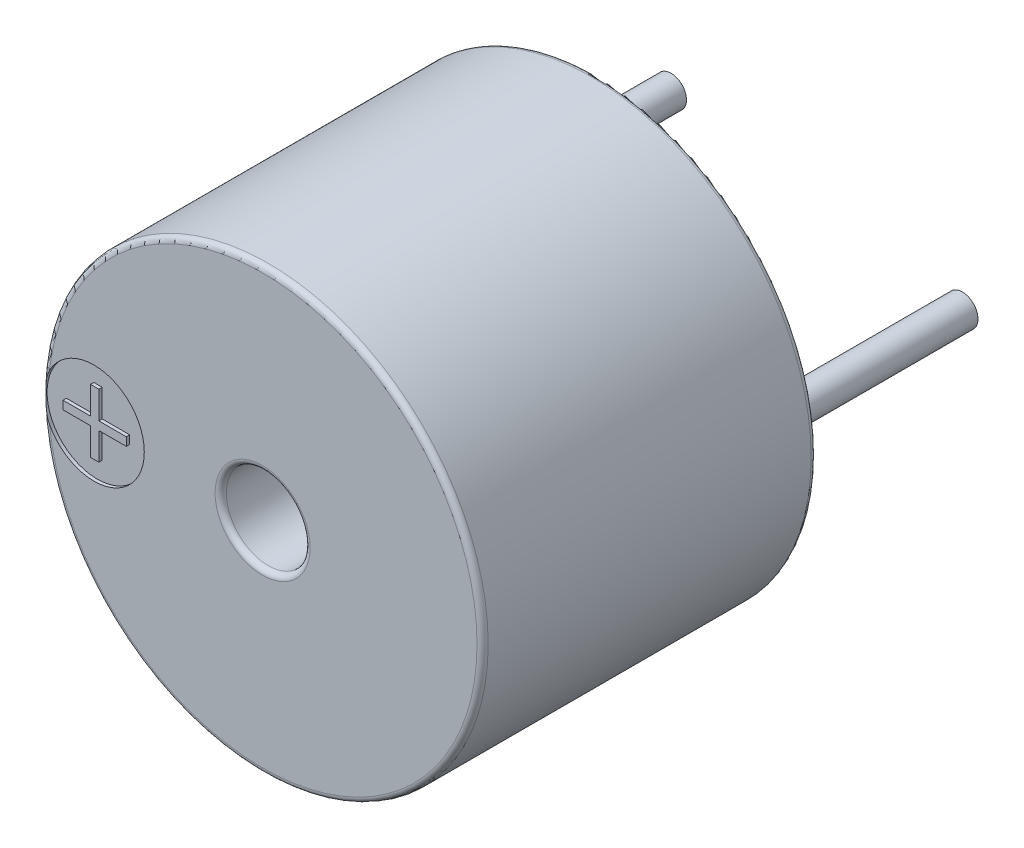
ISO-10303-21;
HEADER;
FILE_DESCRIPTION(('STEP AP214'),'2;1');
FILE_NAME('part.step','',(''),(''),'','','');
FILE_SCHEMA(('AUTOMOTIVE_DESIGN { 1 0 10303 214 1 1 1 1 }'));
ENDSEC;
DATA;
#1=APPLICATION_CONTEXT('core data for automotive mechanical design processes');
#2=APPLICATION_PROTOCOL_DEFINITION('international standard','automotive_design',2000,#1);
#3=PRODUCT_CONTEXT('',#1,'mechanical');
#4=PRODUCT('Part','Part','',(#3));
#5=PRODUCT_RELATED_PRODUCT_CATEGORY('part','',(#4));
#6=PRODUCT_DEFINITION_FORMATION('','',#4);
#7=PRODUCT_DEFINITION_CONTEXT('part definition',#1,'design');
#8=PRODUCT_DEFINITION('design','',#6,#7);
#9=PRODUCT_DEFINITION_SHAPE('','',#8);
#10=(LENGTH_UNIT() NAMED_UNIT(*) SI_UNIT(.MILLI.,.METRE.));
#11=(NAMED_UNIT(*) PLANE_ANGLE_UNIT() SI_UNIT($,.RADIAN.));
#12=(NAMED_UNIT(*) SI_UNIT($,.STERADIAN.) SOLID_ANGLE_UNIT());
#13=UNCERTAINTY_MEASURE_WITH_UNIT(LENGTH_MEASURE(1.E-05),#10,'distance_accuracy_value','');
#14=(GEOMETRIC_REPRESENTATION_CONTEXT(3) GLOBAL_UNCERTAINTY_ASSIGNED_CONTEXT((#13)) GLOBAL_UNIT_ASSIGNED_CONTEXT((#10,
#11,#12)) REPRESENTATION_CONTEXT('',''));
#15=CARTESIAN_POINT('',(0.,0.,0.));
#16=DIRECTION('',(0.,0.,1.));
#17=DIRECTION('',(1.,0.,0.));
#18=AXIS2_PLACEMENT_3D('',#15,#16,#17);
#19=CARTESIAN_POINT('',(0.,0.,7.5946));
#20=DIRECTION('',(0.,0.,1.));
#21=DIRECTION('',(1.,0.,0.));
#22=AXIS2_PLACEMENT_3D('',#19,#20,#21);
#23=PLANE('',#22);
#24=CARTESIAN_POINT('',(-3.83251607709667,0.,7.5946));
#25=DIRECTION('',(0.,0.,1.));
#26=DIRECTION('',(1.,0.,0.));
#27=AXIS2_PLACEMENT_3D('',#24,#25,#26);
#28=CIRCLE('',#27,1.143);
#29=CARTESIAN_POINT('',(-4.84379696449058,-0.532691249028728,7.5946));
#30=VERTEX_POINT('',#29);
#31=CARTESIAN_POINT('',(-4.84379696449059,0.532691249028715,7.5946));
#32=VERTEX_POINT('',#31);
#33=EDGE_CURVE('E63',#30,#32,#28,.T.);
#34=ORIENTED_EDGE('',*,*,#33,.F.);
#35=CARTESIAN_POINT('',(0.,0.,7.5946));
#36=DIRECTION('',(0.,0.,1.));
#37=DIRECTION('',(1.,0.,0.));
#38=AXIS2_PLACEMENT_3D('',#35,#36,#37);
#39=CIRCLE('',#38,4.873);
#40=EDGE_CURVE('E248',#30,#32,#39,.T.);
#41=ORIENTED_EDGE('',*,*,#40,.T.);
#42=EDGE_LOOP('',(#34,#41));
#43=FACE_BOUND('',#42,.T.);
#44=CARTESIAN_POINT('',(0.,0.,7.5946));
#45=DIRECTION('',(0.,0.,1.));
#46=DIRECTION('',(1.,0.,0.));
#47=AXIS2_PLACEMENT_3D('',#44,#45,#46);
#48=CIRCLE('',#47,1.0795);
#49=CARTESIAN_POINT('',(1.0795,0.,7.5946));
#50=VERTEX_POINT('',#49);
#51=EDGE_CURVE('E251',#50,#50,#48,.F.);
#52=ORIENTED_EDGE('',*,*,#51,.T.);
#53=EDGE_LOOP('',(#52));
#54=FACE_BOUND('',#53,.T.);
#55=ADVANCED_FACE('F37',(#43,#54),#23,.T.);
#56=CARTESIAN_POINT('',(0.,0.,0.));
#57=DIRECTION('',(0.,0.,1.));
#58=DIRECTION('',(1.,0.,0.));
#59=AXIS2_PLACEMENT_3D('',#56,#57,#58);
#60=PLANE('',#59);
#61=CARTESIAN_POINT('',(0.,0.,0.));
#62=DIRECTION('',(0.,0.,1.));
#63=DIRECTION('',(1.,0.,0.));
#64=AXIS2_PLACEMENT_3D('',#61,#62,#63);
#65=CIRCLE('',#64,4.873);
#66=CARTESIAN_POINT('',(4.873,0.,0.));
#67=VERTEX_POINT('',#66);
#68=EDGE_CURVE('E260',#67,#67,#65,.F.);
#69=ORIENTED_EDGE('',*,*,#68,.T.);
#70=EDGE_LOOP('',(#69));
#71=FACE_BOUND('',#70,.T.);
#72=CARTESIAN_POINT('',(-3.81,0.,0.));
#73=DIRECTION('',(0.,0.,1.));
#74=DIRECTION('',(1.,0.,0.));
#75=AXIS2_PLACEMENT_3D('',#72,#73,#74);
#76=CIRCLE('',#75,0.35);
#77=CARTESIAN_POINT('',(-3.46,0.,0.));
#78=VERTEX_POINT('',#77);
#79=EDGE_CURVE('E263',#78,#78,#76,.F.);
#80=ORIENTED_EDGE('',*,*,#79,.F.);
#81=EDGE_LOOP('',(#80));
#82=FACE_BOUND('',#81,.T.);
#83=CARTESIAN_POINT('',(3.81,0.,0.));
#84=DIRECTION('',(0.,0.,1.));
#85=DIRECTION('',(1.,0.,0.));
#86=AXIS2_PLACEMENT_3D('',#83,#84,#85);
#87=CIRCLE('',#86,0.3556);
#88=CARTESIAN_POINT('',(4.1656,0.,0.));
#89=VERTEX_POINT('',#88);
#90=EDGE_CURVE('E50',#89,#89,#87,.F.);
#91=ORIENTED_EDGE('',*,*,#90,.F.);
#92=EDGE_LOOP('',(#91));
#93=FACE_BOUND('',#92,.T.);
#94=ADVANCED_FACE('F270',(#71,#82,#93),#60,.F.);
#95=CARTESIAN_POINT('',(0.,0.,7.5946));
#96=DIRECTION('',(0.,0.,-1.));
#97=DIRECTION('',(-1.,0.,0.));
#98=AXIS2_PLACEMENT_3D('',#95,#96,#97);
#99=CYLINDRICAL_SURFACE('',#98,5.);
#100=CARTESIAN_POINT('',(0.,0.,0.127));
#101=DIRECTION('',(0.,0.,1.));
#102=DIRECTION('',(1.,0.,0.));
#103=AXIS2_PLACEMENT_3D('',#100,#101,#102);
#104=CIRCLE('',#103,5.);
#105=CARTESIAN_POINT('',(5.,0.,0.127));
#106=VERTEX_POINT('',#105);
#107=EDGE_CURVE('E257',#106,#106,#104,.T.);
#108=ORIENTED_EDGE('',*,*,#107,.T.);
#109=EDGE_LOOP('',(#108));
#110=FACE_BOUND('',#109,.T.);
#111=CARTESIAN_POINT('',(0.,0.,7.4676));
#112=DIRECTION('',(0.,0.,1.));
#113=DIRECTION('',(1.,0.,0.));
#114=AXIS2_PLACEMENT_3D('',#111,#112,#113);
#115=CIRCLE('',#114,5.);
#116=CARTESIAN_POINT('',(5.,0.,7.4676));
#117=VERTEX_POINT('',#116);
#118=EDGE_CURVE('E254',#117,#117,#115,.F.);
#119=ORIENTED_EDGE('',*,*,#118,.T.);
#120=EDGE_LOOP('',(#119));
#121=FACE_BOUND('',#120,.T.);
#122=ADVANCED_FACE('F272',(#110,#121),#99,.T.);
#123=CARTESIAN_POINT('',(0.,0.,5.0546));
#124=DIRECTION('',(0.,0.,1.));
#125=DIRECTION('',(1.,0.,0.));
#126=AXIS2_PLACEMENT_3D('',#123,#124,#125);
#127=CYLINDRICAL_SURFACE('',#126,0.9525);
#128=CARTESIAN_POINT('',(0.,0.,7.4676));
#129=DIRECTION('',(0.,0.,1.));
#130=DIRECTION('',(1.,0.,0.));
#131=AXIS2_PLACEMENT_3D('',#128,#129,#130);
#132=CIRCLE('',#131,0.9525);
#133=CARTESIAN_POINT('',(0.9525,0.,7.4676));
#134=VERTEX_POINT('',#133);
#135=EDGE_CURVE('E245',#134,#134,#132,.T.);
#136=ORIENTED_EDGE('',*,*,#135,.T.);
#137=EDGE_LOOP('',(#136));
#138=FACE_BOUND('',#137,.T.);
#139=CARTESIAN_POINT('',(0.,0.,5.0546));
#140=DIRECTION('',(0.,0.,1.));
#141=DIRECTION('',(1.,0.,0.));
#142=AXIS2_PLACEMENT_3D('',#139,#140,#141);
#143=CIRCLE('',#142,0.9525);
#144=CARTESIAN_POINT('',(0.9525,0.,5.0546));
#145=VERTEX_POINT('',#144);
#146=EDGE_CURVE('E242',#145,#145,#143,.T.);
#147=ORIENTED_EDGE('',*,*,#146,.F.);
#148=EDGE_LOOP('',(#147));
#149=FACE_BOUND('',#148,.T.);
#150=ADVANCED_FACE('F279',(#138,#149),#127,.F.);
#151=CARTESIAN_POINT('',(0.,0.,5.0546));
#152=DIRECTION('',(0.,0.,1.));
#153=DIRECTION('',(1.,0.,0.));
#154=AXIS2_PLACEMENT_3D('',#151,#152,#153);
#155=PLANE('',#154);
#156=ORIENTED_EDGE('',*,*,#146,.T.);
#157=EDGE_LOOP('',(#156));
#158=FACE_BOUND('',#157,.T.);
#159=ADVANCED_FACE('F291',(#158),#155,.T.);
#160=CARTESIAN_POINT('',(0.,0.,7.4676));
#161=DIRECTION('',(0.,0.,1.));
#162=DIRECTION('',(1.,0.,0.));
#163=AXIS2_PLACEMENT_3D('',#160,#161,#162);
#164=TOROIDAL_SURFACE('',#163,1.0795,0.127);
#165=ORIENTED_EDGE('',*,*,#51,.F.);
#166=EDGE_LOOP('',(#165));
#167=FACE_BOUND('',#166,.T.);
#168=ORIENTED_EDGE('',*,*,#135,.F.);
#169=EDGE_LOOP('',(#168));
#170=FACE_BOUND('',#169,.T.);
#171=ADVANCED_FACE('F288',(#167,#170),#164,.T.);
#172=CARTESIAN_POINT('',(0.,0.,0.127));
#173=DIRECTION('',(0.,0.,1.));
#174=DIRECTION('',(1.,0.,0.));
#175=AXIS2_PLACEMENT_3D('',#172,#173,#174);
#176=TOROIDAL_SURFACE('',#175,4.873,0.127);
#177=ORIENTED_EDGE('',*,*,#68,.F.);
#178=EDGE_LOOP('',(#177));
#179=FACE_BOUND('',#178,.T.);
#180=ORIENTED_EDGE('',*,*,#107,.F.);
#181=EDGE_LOOP('',(#180));
#182=FACE_BOUND('',#181,.T.);
#183=ADVANCED_FACE('F290',(#179,#182),#176,.T.);
#184=CARTESIAN_POINT('',(0.,0.,7.4676));
#185=DIRECTION('',(0.,0.,1.));
#186=DIRECTION('',(1.,0.,0.));
#187=AXIS2_PLACEMENT_3D('',#184,#185,#186);
#188=TOROIDAL_SURFACE('',#187,4.873,0.127);
#189=CARTESIAN_POINT('',(-4.69745845903675,0.747210596768954,7.5182));
#190=CARTESIAN_POINT('',(-4.70116937124147,0.742921263114421,7.52502221150194));
#191=CARTESIAN_POINT('',(-4.70531124399673,0.738056640118191,7.53112279611723));
#192=CARTESIAN_POINT('',(-4.71407015203459,0.727567740906886,7.54202186787289));
#193=CARTESIAN_POINT('',(-4.71867918855592,0.721955862465545,7.54683840056932));
#194=CARTESIAN_POINT('',(-4.73097700800258,0.706656875703947,7.5581273651317));
#195=CARTESIAN_POINT('',(-4.73883813510959,0.69656256098492,7.56383216947132));
#196=CARTESIAN_POINT('',(-4.7546484170271,0.675498138536042,7.57345217922534));
#197=CARTESIAN_POINT('',(-4.76259768829452,0.664520509141095,7.57734955510566));
#198=CARTESIAN_POINT('',(-4.78587332551181,0.631097733341459,7.58688414657996));
#199=CARTESIAN_POINT('',(-4.80086819854182,0.607867485108029,7.59053631939365));
#200=CARTESIAN_POINT('',(-4.82917683137928,0.560259388701499,7.59457940606171));
#201=CARTESIAN_POINT('',(-4.84249114748073,0.535881923964897,7.59497140189505));
#202=CARTESIAN_POINT('',(-4.86693847798388,0.486974691354747,7.59364858206937));
#203=CARTESIAN_POINT('',(-4.87812220699016,0.462468380951815,7.59199256106861));
#204=CARTESIAN_POINT('',(-4.89869973790799,0.412825788224551,7.58739275760235));
#205=CARTESIAN_POINT('',(-4.90809185862105,0.387688938997463,7.58444777406031));
#206=CARTESIAN_POINT('',(-4.93358245284294,0.311415334499745,7.5744998685001));
#207=CARTESIAN_POINT('',(-4.94695980325031,0.259486631648179,7.56638936735026));
#208=CARTESIAN_POINT('',(-4.96270003743651,0.173927621084366,7.55472020195382));
#209=CARTESIAN_POINT('',(-4.96731349380302,0.140766671080162,7.55059728047346));
#210=CARTESIAN_POINT('',(-4.97360103094399,0.074071638771766,7.54464660361836));
#211=CARTESIAN_POINT('',(-4.97528868418159,0.0405400095251573,7.54280826165812));
#212=CARTESIAN_POINT('',(-4.97565001314166,-0.0183020337735343,7.54241761471117));
#213=CARTESIAN_POINT('',(-4.97496283003668,-0.0436063004411562,7.54316837616504));
#214=CARTESIAN_POINT('',(-4.97192218984274,-0.0940290883985537,7.54623195289575));
#215=CARTESIAN_POINT('',(-4.9695674597031,-0.119147452952466,7.54854596153573));
#216=CARTESIAN_POINT('',(-4.96319659718545,-0.169275957234683,7.55414676961853));
#217=CARTESIAN_POINT('',(-4.95916654305105,-0.194283372155677,7.55744165330497));
#218=CARTESIAN_POINT('',(-4.9494744188683,-0.243912380165704,7.56435929318754));
#219=CARTESIAN_POINT('',(-4.94381277953777,-0.268534073274098,7.56798196267946));
#220=CARTESIAN_POINT('',(-4.9230456182388,-0.346833606872873,7.57929221825771));
#221=CARTESIAN_POINT('',(-4.90477547145607,-0.399813103638741,7.5866240336375));
#222=CARTESIAN_POINT('',(-4.87164908188132,-0.476893048118682,7.59301500012828));
#223=CARTESIAN_POINT('',(-4.85971745777649,-0.502083838335564,7.59438142875659));
#224=CARTESIAN_POINT('',(-4.8340352795951,-0.551523687831901,7.59477239620264));
#225=CARTESIAN_POINT('',(-4.82028916336739,-0.5757748637812,7.59380255227918));
#226=CARTESIAN_POINT('',(-4.79812494861984,-0.611770317767776,7.58953330188839));
#227=CARTESIAN_POINT('',(-4.79025789088481,-0.624010390969659,7.58755097762239));
#228=CARTESIAN_POINT('',(-4.77416701808184,-0.648036447411144,7.58225032487346));
#229=CARTESIAN_POINT('',(-4.76594211517781,-0.659820805506998,7.57892762561063));
#230=CARTESIAN_POINT('',(-4.75059129667302,-0.680978692112939,7.57112874709274));
#231=CARTESIAN_POINT('',(-4.74348196648895,-0.690451640661641,7.56689458212344));
#232=CARTESIAN_POINT('',(-4.72947474793439,-0.708549722705912,7.5567606884735));
#233=CARTESIAN_POINT('',(-4.722575606351,-0.717181152529502,7.55087485505057));
#234=CARTESIAN_POINT('',(-4.71266100657501,-0.729261582468367,7.54027134924023));
#235=CARTESIAN_POINT('',(-4.70938209904009,-0.733196814308224,7.53636722149675));
#236=CARTESIAN_POINT('',(-4.7031357238128,-0.740604343450083,7.5278425258534));
#237=CARTESIAN_POINT('',(-4.70017154109978,-0.744071844017098,7.52321545197615));
#238=CARTESIAN_POINT('',(-4.69745845903675,-0.747210596768958,7.5182));
#239=B_SPLINE_CURVE_WITH_KNOTS('',3,(#189,#190,#191,#192,#193,#194,#195,#196,#197,#198,#199,
#200,#201,#202,#203,#204,#205,#206,#207,#208,#209,#210,#211,#212,#213,#214,#215,#216,#217,#218,
#219,#220,#221,#222,#223,#224,#225,#226,#227,#228,#229,#230,#231,#232,#233,#234,#235,#236,#237,
#238),.UNSPECIFIED.,.F.,.F.,(4,2,2,2,2,2,2,2,2,2,2,2,2,2,2,2,2,2,2,2,2,2,2,2,4),(0.,
0.0264183486383536,0.0524430946682446,0.0942531305663028,0.136467264026721,0.219670027365705,
0.302845176488041,0.383686982642228,0.464604279435246,0.626675202671039,0.727744400675952,
0.828343483109025,0.904202896931776,0.980120286410114,1.05668156748594,1.1332226558386,
1.30189375100045,1.3855060988799,1.46891761264864,1.51292129293819,1.55706963833069,
1.5947146609482,1.63205201574277,1.65131691377351,1.67076639317122),.UNSPECIFIED.);
#240=EDGE_CURVE('E11',#32,#30,#239,.T.);
#241=ORIENTED_EDGE('',*,*,#240,.F.);
#242=ORIENTED_EDGE('',*,*,#40,.F.);
#243=EDGE_LOOP('',(#241,#242));
#244=FACE_BOUND('',#243,.T.);
#245=ORIENTED_EDGE('',*,*,#118,.F.);
#246=EDGE_LOOP('',(#245));
#247=FACE_BOUND('',#246,.T.);
#248=ADVANCED_FACE('F39',(#244,#247),#188,.T.);
#249=CARTESIAN_POINT('',(-3.81,0.,-5.5));
#250=DIRECTION('',(0.,0.,1.));
#251=DIRECTION('',(1.,0.,0.));
#252=AXIS2_PLACEMENT_3D('',#249,#250,#251);
#253=CYLINDRICAL_SURFACE('',#252,0.35);
#254=CARTESIAN_POINT('',(-3.81,0.,-5.5));
#255=DIRECTION('',(0.,0.,-1.));
#256=DIRECTION('',(-1.,0.,0.));
#257=AXIS2_PLACEMENT_3D('',#254,#255,#256);
#258=CIRCLE('',#257,0.35);
#259=CARTESIAN_POINT('',(-4.16,0.,-5.5));
#260=VERTEX_POINT('',#259);
#261=EDGE_CURVE('E239',#260,#260,#258,.T.);
#262=ORIENTED_EDGE('',*,*,#261,.F.);
#263=EDGE_LOOP('',(#262));
#264=FACE_BOUND('',#263,.T.);
#265=ORIENTED_EDGE('',*,*,#79,.T.);
#266=EDGE_LOOP('',(#265));
#267=FACE_BOUND('',#266,.T.);
#268=ADVANCED_FACE('F298',(#264,#267),#253,.T.);
#269=CARTESIAN_POINT('',(-3.81,0.,-5.5));
#270=DIRECTION('',(0.,0.,-1.));
#271=DIRECTION('',(-1.,0.,0.));
#272=AXIS2_PLACEMENT_3D('',#269,#270,#271);
#273=PLANE('',#272);
#274=ORIENTED_EDGE('',*,*,#261,.T.);
#275=EDGE_LOOP('',(#274));
#276=FACE_BOUND('',#275,.T.);
#277=ADVANCED_FACE('F309',(#276),#273,.T.);
#278=CARTESIAN_POINT('',(3.81,0.,-4.5));
#279=DIRECTION('',(0.,0.,1.));
#280=DIRECTION('',(1.,0.,0.));
#281=AXIS2_PLACEMENT_3D('',#278,#279,#280);
#282=CYLINDRICAL_SURFACE('',#281,0.3556);
#283=CARTESIAN_POINT('',(3.81,0.,-4.5));
#284=DIRECTION('',(0.,0.,-1.));
#285=DIRECTION('',(-1.,0.,0.));
#286=AXIS2_PLACEMENT_3D('',#283,#284,#285);
#287=CIRCLE('',#286,0.3556);
#288=CARTESIAN_POINT('',(3.4544,0.,-4.5));
#289=VERTEX_POINT('',#288);
#290=EDGE_CURVE('E235',#289,#289,#287,.T.);
#291=ORIENTED_EDGE('',*,*,#290,.F.);
#292=EDGE_LOOP('',(#291));
#293=FACE_BOUND('',#292,.T.);
#294=ORIENTED_EDGE('',*,*,#90,.T.);
#295=EDGE_LOOP('',(#294));
#296=FACE_BOUND('',#295,.T.);
#297=ADVANCED_FACE('F268',(#293,#296),#282,.T.);
#298=CARTESIAN_POINT('',(3.81,0.,-4.5));
#299=DIRECTION('',(0.,0.,-1.));
#300=DIRECTION('',(-1.,0.,0.));
#301=AXIS2_PLACEMENT_3D('',#298,#299,#300);
#302=PLANE('',#301);
#303=ORIENTED_EDGE('',*,*,#290,.T.);
#304=EDGE_LOOP('',(#303));
#305=FACE_BOUND('',#304,.T.);
#306=ADVANCED_FACE('F332',(#305),#302,.T.);
#307=CARTESIAN_POINT('',(-3.83251607709667,0.,7.5184));
#308=DIRECTION('',(0.,0.,1.));
#309=DIRECTION('',(1.,0.,0.));
#310=AXIS2_PLACEMENT_3D('',#307,#308,#309);
#311=PLANE('',#310);
#312=CARTESIAN_POINT('',(-3.83251607709667,0.,7.5184));
#313=DIRECTION('',(0.,0.,1.));
#314=DIRECTION('',(1.,0.,0.));
#315=AXIS2_PLACEMENT_3D('',#312,#313,#314);
#316=CIRCLE('',#315,1.143);
#317=CARTESIAN_POINT('',(-2.68951607709667,0.,7.5184));
#318=VERTEX_POINT('',#317);
#319=EDGE_CURVE('E232',#318,#318,#316,.T.);
#320=ORIENTED_EDGE('',*,*,#319,.T.);
#321=EDGE_LOOP('',(#320));
#322=FACE_BOUND('',#321,.T.);
#323=DIRECTION('',(1.,0.,0.));
#324=VECTOR('',#323,1.);
#325=CARTESIAN_POINT('',(-4.53617948717949,0.0983435897435895,7.5184));
#326=LINE('',#325,#324);
#327=CARTESIAN_POINT('',(-4.53617948717949,0.0983435897435895,7.5184));
#328=VERTEX_POINT('',#327);
#329=CARTESIAN_POINT('',(-3.91203418803419,0.0983435897435895,7.5184));
#330=VERTEX_POINT('',#329);
#331=EDGE_CURVE('E135',#328,#330,#326,.T.);
#332=ORIENTED_EDGE('',*,*,#331,.T.);
#333=DIRECTION('',(0.,1.,0.));
#334=VECTOR('',#333,1.);
#335=CARTESIAN_POINT('',(-3.91203418803419,0.0983435897435895,7.5184));
#336=LINE('',#335,#334);
#337=CARTESIAN_POINT('',(-3.91203418803419,0.722488888888889,7.5184));
#338=VERTEX_POINT('',#337);
#339=EDGE_CURVE('E139',#330,#338,#336,.T.);
#340=ORIENTED_EDGE('',*,*,#339,.T.);
#341=DIRECTION('',(1.,0.,0.));
#342=VECTOR('',#341,1.);
#343=CARTESIAN_POINT('',(-3.91203418803419,0.722488888888889,7.5184));
#344=LINE('',#343,#342);
#345=CARTESIAN_POINT('',(-3.72207692307692,0.722488888888889,7.5184));
#346=VERTEX_POINT('',#345);
#347=EDGE_CURVE('E160',#338,#346,#344,.T.);
#348=ORIENTED_EDGE('',*,*,#347,.T.);
#349=DIRECTION('',(0.,-1.,0.));
#350=VECTOR('',#349,1.);
#351=CARTESIAN_POINT('',(-3.72207692307692,0.722488888888889,7.5184));
#352=LINE('',#351,#350);
#353=CARTESIAN_POINT('',(-3.72207692307692,0.0983435897435895,7.5184));
#354=VERTEX_POINT('',#353);
#355=EDGE_CURVE('E162',#346,#354,#352,.T.);
#356=ORIENTED_EDGE('',*,*,#355,.T.);
#357=DIRECTION('',(1.,0.,0.));
#358=VECTOR('',#357,1.);
#359=CARTESIAN_POINT('',(-3.72207692307692,0.0983435897435895,7.5184));
#360=LINE('',#359,#358);
#361=CARTESIAN_POINT('',(-3.09793162393162,0.0983435897435895,7.5184));
#362=VERTEX_POINT('',#361);
#363=EDGE_CURVE('E166',#354,#362,#360,.T.);
#364=ORIENTED_EDGE('',*,*,#363,.T.);
#365=DIRECTION('',(0.,-1.,0.));
#366=VECTOR('',#365,1.);
#367=CARTESIAN_POINT('',(-3.09793162393162,0.0983435897435895,7.5184));
#368=LINE('',#367,#366);
#369=CARTESIAN_POINT('',(-3.09793162393162,-0.0916136752136754,7.5184));
#370=VERTEX_POINT('',#369);
#371=EDGE_CURVE('E168',#362,#370,#368,.T.);
#372=ORIENTED_EDGE('',*,*,#371,.T.);
#373=DIRECTION('',(-1.,0.,0.));
#374=VECTOR('',#373,1.);
#375=CARTESIAN_POINT('',(-3.09793162393162,-0.0916136752136754,7.5184));
#376=LINE('',#375,#374);
#377=CARTESIAN_POINT('',(-3.72207692307692,-0.0916136752136754,7.5184));
#378=VERTEX_POINT('',#377);
#379=EDGE_CURVE('E170',#370,#378,#376,.T.);
#380=ORIENTED_EDGE('',*,*,#379,.T.);
#381=DIRECTION('',(0.,-1.,0.));
#382=VECTOR('',#381,1.);
#383=CARTESIAN_POINT('',(-3.72207692307692,-0.0916136752136754,7.5184));
#384=LINE('',#383,#382);
#385=CARTESIAN_POINT('',(-3.72207692307692,-0.715758974358975,7.5184));
#386=VERTEX_POINT('',#385);
#387=EDGE_CURVE('E172',#378,#386,#384,.T.);
#388=ORIENTED_EDGE('',*,*,#387,.T.);
#389=DIRECTION('',(-1.,0.,0.));
#390=VECTOR('',#389,1.);
#391=CARTESIAN_POINT('',(-3.72207692307692,-0.715758974358975,7.5184));
#392=LINE('',#391,#390);
#393=CARTESIAN_POINT('',(-3.91203418803419,-0.715758974358975,7.5184));
#394=VERTEX_POINT('',#393);
#395=EDGE_CURVE('E174',#386,#394,#392,.T.);
#396=ORIENTED_EDGE('',*,*,#395,.T.);
#397=DIRECTION('',(0.,1.,0.));
#398=VECTOR('',#397,1.);
#399=CARTESIAN_POINT('',(-3.91203418803419,-0.715758974358975,7.5184));
#400=LINE('',#399,#398);
#401=CARTESIAN_POINT('',(-3.91203418803419,-0.0916136752136754,7.5184));
#402=VERTEX_POINT('',#401);
#403=EDGE_CURVE('E176',#394,#402,#400,.T.);
#404=ORIENTED_EDGE('',*,*,#403,.T.);
#405=DIRECTION('',(-1.,0.,0.));
#406=VECTOR('',#405,1.);
#407=CARTESIAN_POINT('',(-3.91203418803419,-0.0916136752136754,7.5184));
#408=LINE('',#407,#406);
#409=CARTESIAN_POINT('',(-4.53617948717949,-0.0916136752136754,7.5184));
#410=VERTEX_POINT('',#409);
#411=EDGE_CURVE('E178',#402,#410,#408,.T.);
#412=ORIENTED_EDGE('',*,*,#411,.T.);
#413=DIRECTION('',(0.,1.,0.));
#414=VECTOR('',#413,1.);
#415=CARTESIAN_POINT('',(-4.53617948717949,-0.0916136752136754,7.5184));
#416=LINE('',#415,#414);
#417=EDGE_CURVE('E143',#410,#328,#416,.T.);
#418=ORIENTED_EDGE('',*,*,#417,.T.);
#419=EDGE_LOOP('',(#332,#340,#348,#356,#364,#372,#380,#388,#396,#404,#412,#418));
#420=FACE_BOUND('',#419,.T.);
#421=ADVANCED_FACE('F137',(#322,#420),#311,.T.);
#422=CARTESIAN_POINT('',(-3.83251607709667,0.,7.5184));
#423=DIRECTION('',(0.,0.,1.));
#424=DIRECTION('',(1.,0.,0.));
#425=AXIS2_PLACEMENT_3D('',#422,#423,#424);
#426=CYLINDRICAL_SURFACE('',#425,1.143);
#427=ORIENTED_EDGE('',*,*,#240,.T.);
#428=ORIENTED_EDGE('',*,*,#33,.T.);
#429=EDGE_LOOP('',(#427,#428));
#430=FACE_BOUND('',#429,.T.);
#431=ORIENTED_EDGE('',*,*,#319,.F.);
#432=EDGE_LOOP('',(#431));
#433=FACE_BOUND('',#432,.T.);
#434=ADVANCED_FACE('F336',(#430,#433),#426,.F.);
#435=CARTESIAN_POINT('',(-4.53617948717949,0.0983435897435895,7.5184));
#436=DIRECTION('',(0.,-1.,0.));
#437=DIRECTION('',(0.,0.,-1.));
#438=AXIS2_PLACEMENT_3D('',#435,#436,#437);
#439=PLANE('',#438);
#440=DIRECTION('',(1.,0.,0.));
#441=VECTOR('',#440,1.);
#442=CARTESIAN_POINT('',(-4.53617948717949,0.0983435897435895,7.5946));
#443=LINE('',#442,#441);
#444=CARTESIAN_POINT('',(-4.53617948717949,0.0983435897435895,7.5946));
#445=VERTEX_POINT('',#444);
#446=CARTESIAN_POINT('',(-3.91203418803419,0.0983435897435895,7.5946));
#447=VERTEX_POINT('',#446);
#448=EDGE_CURVE('E152',#445,#447,#443,.T.);
#449=ORIENTED_EDGE('',*,*,#448,.T.);
#450=DIRECTION('',(0.,0.,1.));
#451=VECTOR('',#450,1.);
#452=CARTESIAN_POINT('',(-3.91203418803419,0.0983435897435895,7.5184));
#453=LINE('',#452,#451);
#454=EDGE_CURVE('E149',#330,#447,#453,.T.);
#455=ORIENTED_EDGE('',*,*,#454,.F.);
#456=ORIENTED_EDGE('',*,*,#331,.F.);
#457=DIRECTION('',(0.,0.,1.));
#458=VECTOR('',#457,1.);
#459=CARTESIAN_POINT('',(-4.53617948717949,0.0983435897435895,7.5184));
#460=LINE('',#459,#458);
#461=EDGE_CURVE('E181',#328,#445,#460,.T.);
#462=ORIENTED_EDGE('',*,*,#461,.T.);
#463=EDGE_LOOP('',(#449,#455,#456,#462));
#464=FACE_BOUND('',#463,.T.);
#465=ADVANCED_FACE('F150',(#464),#439,.F.);
#466=CARTESIAN_POINT('',(-3.91203418803419,0.0983435897435895,7.5184));
#467=DIRECTION('',(1.,0.,0.));
#468=DIRECTION('',(0.,0.,-1.));
#469=AXIS2_PLACEMENT_3D('',#466,#467,#468);
#470=PLANE('',#469);
#471=DIRECTION('',(0.,1.,0.));
#472=VECTOR('',#471,1.);
#473=CARTESIAN_POINT('',(-3.91203418803419,0.0983435897435895,7.5946));
#474=LINE('',#473,#472);
#475=CARTESIAN_POINT('',(-3.91203418803419,0.722488888888889,7.5946));
#476=VERTEX_POINT('',#475);
#477=EDGE_CURVE('E183',#447,#476,#474,.T.);
#478=ORIENTED_EDGE('',*,*,#477,.T.);
#479=DIRECTION('',(0.,0.,1.));
#480=VECTOR('',#479,1.);
#481=CARTESIAN_POINT('',(-3.91203418803419,0.722488888888889,7.5184));
#482=LINE('',#481,#480);
#483=EDGE_CURVE('E156',#338,#476,#482,.T.);
#484=ORIENTED_EDGE('',*,*,#483,.F.);
#485=ORIENTED_EDGE('',*,*,#339,.F.);
#486=ORIENTED_EDGE('',*,*,#454,.T.);
#487=EDGE_LOOP('',(#478,#484,#485,#486));
#488=FACE_BOUND('',#487,.T.);
#489=ADVANCED_FACE('F158',(#488),#470,.F.);
#490=CARTESIAN_POINT('',(-3.91203418803419,0.722488888888889,7.5184));
#491=DIRECTION('',(0.,-1.,0.));
#492=DIRECTION('',(0.,0.,-1.));
#493=AXIS2_PLACEMENT_3D('',#490,#491,#492);
#494=PLANE('',#493);
#495=DIRECTION('',(1.,0.,0.));
#496=VECTOR('',#495,1.);
#497=CARTESIAN_POINT('',(-3.91203418803419,0.722488888888889,7.5946));
#498=LINE('',#497,#496);
#499=CARTESIAN_POINT('',(-3.72207692307692,0.722488888888889,7.5946));
#500=VERTEX_POINT('',#499);
#501=EDGE_CURVE('E185',#476,#500,#498,.T.);
#502=ORIENTED_EDGE('',*,*,#501,.T.);
#503=DIRECTION('',(0.,0.,1.));
#504=VECTOR('',#503,1.);
#505=CARTESIAN_POINT('',(-3.72207692307692,0.722488888888889,7.5184));
#506=LINE('',#505,#504);
#507=EDGE_CURVE('E229',#346,#500,#506,.T.);
#508=ORIENTED_EDGE('',*,*,#507,.F.);
#509=ORIENTED_EDGE('',*,*,#347,.F.);
#510=ORIENTED_EDGE('',*,*,#483,.T.);
#511=EDGE_LOOP('',(#502,#508,#509,#510));
#512=FACE_BOUND('',#511,.T.);
#513=ADVANCED_FACE('F347',(#512),#494,.F.);
#514=CARTESIAN_POINT('',(-3.72207692307692,0.722488888888889,7.5184));
#515=DIRECTION('',(-1.,0.,0.));
#516=DIRECTION('',(0.,0.,1.));
#517=AXIS2_PLACEMENT_3D('',#514,#515,#516);
#518=PLANE('',#517);
#519=DIRECTION('',(0.,-1.,0.));
#520=VECTOR('',#519,1.);
#521=CARTESIAN_POINT('',(-3.72207692307692,0.722488888888889,7.5946));
#522=LINE('',#521,#520);
#523=CARTESIAN_POINT('',(-3.72207692307692,0.0983435897435895,7.5946));
#524=VERTEX_POINT('',#523);
#525=EDGE_CURVE('E188',#500,#524,#522,.T.);
#526=ORIENTED_EDGE('',*,*,#525,.T.);
#527=DIRECTION('',(0.,0.,1.));
#528=VECTOR('',#527,1.);
#529=CARTESIAN_POINT('',(-3.72207692307692,0.0983435897435895,7.5184));
#530=LINE('',#529,#528);
#531=EDGE_CURVE('E227',#354,#524,#530,.T.);
#532=ORIENTED_EDGE('',*,*,#531,.F.);
#533=ORIENTED_EDGE('',*,*,#355,.F.);
#534=ORIENTED_EDGE('',*,*,#507,.T.);
#535=EDGE_LOOP('',(#526,#532,#533,#534));
#536=FACE_BOUND('',#535,.T.);
#537=ADVANCED_FACE('F350',(#536),#518,.F.);
#538=CARTESIAN_POINT('',(-3.72207692307692,0.0983435897435895,7.5184));
#539=DIRECTION('',(0.,-1.,0.));
#540=DIRECTION('',(0.,0.,-1.));
#541=AXIS2_PLACEMENT_3D('',#538,#539,#540);
#542=PLANE('',#541);
#543=DIRECTION('',(1.,0.,0.));
#544=VECTOR('',#543,1.);
#545=CARTESIAN_POINT('',(-3.72207692307692,0.0983435897435895,7.5946));
#546=LINE('',#545,#544);
#547=CARTESIAN_POINT('',(-3.09793162393162,0.0983435897435895,7.5946));
#548=VERTEX_POINT('',#547);
#549=EDGE_CURVE('E191',#524,#548,#546,.T.);
#550=ORIENTED_EDGE('',*,*,#549,.T.);
#551=DIRECTION('',(0.,0.,1.));
#552=VECTOR('',#551,1.);
#553=CARTESIAN_POINT('',(-3.09793162393162,0.0983435897435895,7.5184));
#554=LINE('',#553,#552);
#555=EDGE_CURVE('E225',#362,#548,#554,.T.);
#556=ORIENTED_EDGE('',*,*,#555,.F.);
#557=ORIENTED_EDGE('',*,*,#363,.F.);
#558=ORIENTED_EDGE('',*,*,#531,.T.);
#559=EDGE_LOOP('',(#550,#556,#557,#558));
#560=FACE_BOUND('',#559,.T.);
#561=ADVANCED_FACE('F354',(#560),#542,.F.);
#562=CARTESIAN_POINT('',(-3.09793162393162,0.0983435897435895,7.5184));
#563=DIRECTION('',(-1.,0.,0.));
#564=DIRECTION('',(0.,0.,1.));
#565=AXIS2_PLACEMENT_3D('',#562,#563,#564);
#566=PLANE('',#565);
#567=DIRECTION('',(0.,-1.,0.));
#568=VECTOR('',#567,1.);
#569=CARTESIAN_POINT('',(-3.09793162393162,0.0983435897435895,7.5946));
#570=LINE('',#569,#568);
#571=CARTESIAN_POINT('',(-3.09793162393162,-0.0916136752136754,7.5946));
#572=VERTEX_POINT('',#571);
#573=EDGE_CURVE('E194',#548,#572,#570,.T.);
#574=ORIENTED_EDGE('',*,*,#573,.T.);
#575=DIRECTION('',(0.,0.,1.));
#576=VECTOR('',#575,1.);
#577=CARTESIAN_POINT('',(-3.09793162393162,-0.0916136752136754,7.5184));
#578=LINE('',#577,#576);
#579=EDGE_CURVE('E223',#370,#572,#578,.T.);
#580=ORIENTED_EDGE('',*,*,#579,.F.);
#581=ORIENTED_EDGE('',*,*,#371,.F.);
#582=ORIENTED_EDGE('',*,*,#555,.T.);
#583=EDGE_LOOP('',(#574,#580,#581,#582));
#584=FACE_BOUND('',#583,.T.);
#585=ADVANCED_FACE('F358',(#584),#566,.F.);
#586=CARTESIAN_POINT('',(-3.09793162393162,-0.0916136752136754,7.5184));
#587=DIRECTION('',(0.,1.,0.));
#588=DIRECTION('',(0.,0.,1.));
#589=AXIS2_PLACEMENT_3D('',#586,#587,#588);
#590=PLANE('',#589);
#591=DIRECTION('',(-1.,0.,0.));
#592=VECTOR('',#591,1.);
#593=CARTESIAN_POINT('',(-3.09793162393162,-0.0916136752136754,7.5946));
#594=LINE('',#593,#592);
#595=CARTESIAN_POINT('',(-3.72207692307692,-0.0916136752136754,7.5946));
#596=VERTEX_POINT('',#595);
#597=EDGE_CURVE('E197',#572,#596,#594,.T.);
#598=ORIENTED_EDGE('',*,*,#597,.T.);
#599=DIRECTION('',(0.,0.,1.));
#600=VECTOR('',#599,1.);
#601=CARTESIAN_POINT('',(-3.72207692307692,-0.0916136752136754,7.5184));
#602=LINE('',#601,#600);
#603=EDGE_CURVE('E221',#378,#596,#602,.T.);
#604=ORIENTED_EDGE('',*,*,#603,.F.);
#605=ORIENTED_EDGE('',*,*,#379,.F.);
#606=ORIENTED_EDGE('',*,*,#579,.T.);
#607=EDGE_LOOP('',(#598,#604,#605,#606));
#608=FACE_BOUND('',#607,.T.);
#609=ADVANCED_FACE('F362',(#608),#590,.F.);
#610=CARTESIAN_POINT('',(-3.72207692307692,-0.0916136752136754,7.5184));
#611=DIRECTION('',(-1.,0.,0.));
#612=DIRECTION('',(0.,0.,1.));
#613=AXIS2_PLACEMENT_3D('',#610,#611,#612);
#614=PLANE('',#613);
#615=DIRECTION('',(0.,-1.,0.));
#616=VECTOR('',#615,1.);
#617=CARTESIAN_POINT('',(-3.72207692307692,-0.0916136752136754,7.5946));
#618=LINE('',#617,#616);
#619=CARTESIAN_POINT('',(-3.72207692307692,-0.715758974358975,7.5946));
#620=VERTEX_POINT('',#619);
#621=EDGE_CURVE('E200',#596,#620,#618,.T.);
#622=ORIENTED_EDGE('',*,*,#621,.T.);
#623=DIRECTION('',(0.,0.,1.));
#624=VECTOR('',#623,1.);
#625=CARTESIAN_POINT('',(-3.72207692307692,-0.715758974358975,7.5184));
#626=LINE('',#625,#624);
#627=EDGE_CURVE('E219',#386,#620,#626,.T.);
#628=ORIENTED_EDGE('',*,*,#627,.F.);
#629=ORIENTED_EDGE('',*,*,#387,.F.);
#630=ORIENTED_EDGE('',*,*,#603,.T.);
#631=EDGE_LOOP('',(#622,#628,#629,#630));
#632=FACE_BOUND('',#631,.T.);
#633=ADVANCED_FACE('F366',(#632),#614,.F.);
#634=CARTESIAN_POINT('',(-3.72207692307692,-0.715758974358975,7.5184));
#635=DIRECTION('',(0.,1.,0.));
#636=DIRECTION('',(0.,0.,1.));
#637=AXIS2_PLACEMENT_3D('',#634,#635,#636);
#638=PLANE('',#637);
#639=DIRECTION('',(-1.,0.,0.));
#640=VECTOR('',#639,1.);
#641=CARTESIAN_POINT('',(-3.72207692307692,-0.715758974358975,7.5946));
#642=LINE('',#641,#640);
#643=CARTESIAN_POINT('',(-3.91203418803419,-0.715758974358975,7.5946));
#644=VERTEX_POINT('',#643);
#645=EDGE_CURVE('E203',#620,#644,#642,.T.);
#646=ORIENTED_EDGE('',*,*,#645,.T.);
#647=DIRECTION('',(0.,0.,1.));
#648=VECTOR('',#647,1.);
#649=CARTESIAN_POINT('',(-3.91203418803419,-0.715758974358975,7.5184));
#650=LINE('',#649,#648);
#651=EDGE_CURVE('E217',#394,#644,#650,.T.);
#652=ORIENTED_EDGE('',*,*,#651,.F.);
#653=ORIENTED_EDGE('',*,*,#395,.F.);
#654=ORIENTED_EDGE('',*,*,#627,.T.);
#655=EDGE_LOOP('',(#646,#652,#653,#654));
#656=FACE_BOUND('',#655,.T.);
#657=ADVANCED_FACE('F370',(#656),#638,.F.);
#658=CARTESIAN_POINT('',(-3.91203418803419,-0.715758974358975,7.5184));
#659=DIRECTION('',(1.,0.,0.));
#660=DIRECTION('',(0.,0.,-1.));
#661=AXIS2_PLACEMENT_3D('',#658,#659,#660);
#662=PLANE('',#661);
#663=DIRECTION('',(0.,1.,0.));
#664=VECTOR('',#663,1.);
#665=CARTESIAN_POINT('',(-3.91203418803419,-0.715758974358975,7.5946));
#666=LINE('',#665,#664);
#667=CARTESIAN_POINT('',(-3.91203418803419,-0.0916136752136754,7.5946));
#668=VERTEX_POINT('',#667);
#669=EDGE_CURVE('E206',#644,#668,#666,.T.);
#670=ORIENTED_EDGE('',*,*,#669,.T.);
#671=DIRECTION('',(0.,0.,1.));
#672=VECTOR('',#671,1.);
#673=CARTESIAN_POINT('',(-3.91203418803419,-0.0916136752136754,7.5184));
#674=LINE('',#673,#672);
#675=EDGE_CURVE('E215',#402,#668,#674,.T.);
#676=ORIENTED_EDGE('',*,*,#675,.F.);
#677=ORIENTED_EDGE('',*,*,#403,.F.);
#678=ORIENTED_EDGE('',*,*,#651,.T.);
#679=EDGE_LOOP('',(#670,#676,#677,#678));
#680=FACE_BOUND('',#679,.T.);
#681=ADVANCED_FACE('F374',(#680),#662,.F.);
#682=CARTESIAN_POINT('',(-3.91203418803419,-0.0916136752136754,7.5184));
#683=DIRECTION('',(0.,1.,0.));
#684=DIRECTION('',(0.,0.,1.));
#685=AXIS2_PLACEMENT_3D('',#682,#683,#684);
#686=PLANE('',#685);
#687=DIRECTION('',(-1.,0.,0.));
#688=VECTOR('',#687,1.);
#689=CARTESIAN_POINT('',(-3.91203418803419,-0.0916136752136754,7.5946));
#690=LINE('',#689,#688);
#691=CARTESIAN_POINT('',(-4.53617948717949,-0.0916136752136754,7.5946));
#692=VERTEX_POINT('',#691);
#693=EDGE_CURVE('E57',#668,#692,#690,.T.);
#694=ORIENTED_EDGE('',*,*,#693,.T.);
#695=DIRECTION('',(0.,0.,1.));
#696=VECTOR('',#695,1.);
#697=CARTESIAN_POINT('',(-4.53617948717949,-0.0916136752136754,7.5184));
#698=LINE('',#697,#696);
#699=EDGE_CURVE('E213',#410,#692,#698,.T.);
#700=ORIENTED_EDGE('',*,*,#699,.F.);
#701=ORIENTED_EDGE('',*,*,#411,.F.);
#702=ORIENTED_EDGE('',*,*,#675,.T.);
#703=EDGE_LOOP('',(#694,#700,#701,#702));
#704=FACE_BOUND('',#703,.T.);
#705=ADVANCED_FACE('F378',(#704),#686,.F.);
#706=CARTESIAN_POINT('',(-4.53617948717949,-0.0916136752136754,7.5184));
#707=DIRECTION('',(1.,0.,0.));
#708=DIRECTION('',(0.,0.,-1.));
#709=AXIS2_PLACEMENT_3D('',#706,#707,#708);
#710=PLANE('',#709);
#711=DIRECTION('',(0.,1.,0.));
#712=VECTOR('',#711,1.);
#713=CARTESIAN_POINT('',(-4.53617948717949,-0.0916136752136754,7.5946));
#714=LINE('',#713,#712);
#715=EDGE_CURVE('E146',#692,#445,#714,.T.);
#716=ORIENTED_EDGE('',*,*,#715,.T.);
#717=ORIENTED_EDGE('',*,*,#461,.F.);
#718=ORIENTED_EDGE('',*,*,#417,.F.);
#719=ORIENTED_EDGE('',*,*,#699,.T.);
#720=EDGE_LOOP('',(#716,#717,#718,#719));
#721=FACE_BOUND('',#720,.T.);
#722=ADVANCED_FACE('F382',(#721),#710,.F.);
#723=ORIENTED_EDGE('',*,*,#448,.F.);
#724=ORIENTED_EDGE('',*,*,#715,.F.);
#725=ORIENTED_EDGE('',*,*,#693,.F.);
#726=ORIENTED_EDGE('',*,*,#669,.F.);
#727=ORIENTED_EDGE('',*,*,#645,.F.);
#728=ORIENTED_EDGE('',*,*,#621,.F.);
#729=ORIENTED_EDGE('',*,*,#597,.F.);
#730=ORIENTED_EDGE('',*,*,#573,.F.);
#731=ORIENTED_EDGE('',*,*,#549,.F.);
#732=ORIENTED_EDGE('',*,*,#525,.F.);
#733=ORIENTED_EDGE('',*,*,#501,.F.);
#734=ORIENTED_EDGE('',*,*,#477,.F.);
#735=EDGE_LOOP('',(#723,#724,#725,#726,#727,#728,#729,#730,#731,#732,#733,#734));
#736=FACE_BOUND('',#735,.T.);
#737=ADVANCED_FACE('F284',(#736),#23,.T.);
#738=CLOSED_SHELL('',(#55,#94,#122,#150,#159,#171,#183,#248,#268,#277,#297,#306,#421,#434,#465,
#489,#513,#537,#561,#585,#609,#633,#657,#681,#705,#722,#737));
#739=MANIFOLD_SOLID_BREP('B2',#738);
#740=ADVANCED_BREP_SHAPE_REPRESENTATION('',(#18,#739),#14);
#741=SHAPE_DEFINITION_REPRESENTATION(#9,#740);
ENDSEC;
END-ISO-10303-21;
